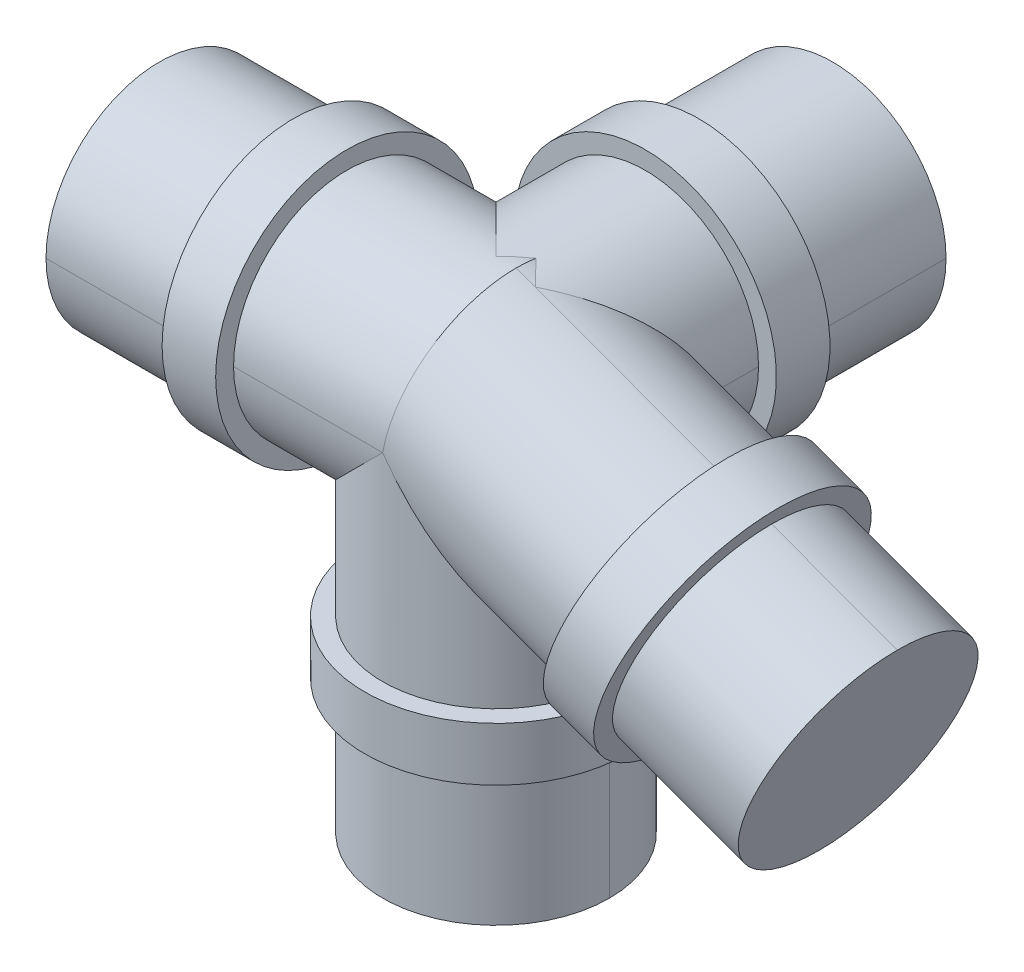
ISO-10303-21;
HEADER;
FILE_DESCRIPTION(('STEP AP214'),'2;1');
FILE_NAME('part.step','',(''),(''),'','','');
FILE_SCHEMA(('AUTOMOTIVE_DESIGN { 1 0 10303 214 1 1 1 1 }'));
ENDSEC;
DATA;
#1=APPLICATION_CONTEXT('core data for automotive mechanical design processes');
#2=APPLICATION_PROTOCOL_DEFINITION('international standard','automotive_design',2000,#1);
#3=PRODUCT_CONTEXT('',#1,'mechanical');
#4=PRODUCT('Part','Part','',(#3));
#5=PRODUCT_RELATED_PRODUCT_CATEGORY('part','',(#4));
#6=PRODUCT_DEFINITION_FORMATION('','',#4);
#7=PRODUCT_DEFINITION_CONTEXT('part definition',#1,'design');
#8=PRODUCT_DEFINITION('design','',#6,#7);
#9=PRODUCT_DEFINITION_SHAPE('','',#8);
#10=(LENGTH_UNIT() NAMED_UNIT(*) SI_UNIT(.MILLI.,.METRE.));
#11=(NAMED_UNIT(*) PLANE_ANGLE_UNIT() SI_UNIT($,.RADIAN.));
#12=(NAMED_UNIT(*) SI_UNIT($,.STERADIAN.) SOLID_ANGLE_UNIT());
#13=UNCERTAINTY_MEASURE_WITH_UNIT(LENGTH_MEASURE(1.E-05),#10,'distance_accuracy_value','');
#14=(GEOMETRIC_REPRESENTATION_CONTEXT(3) GLOBAL_UNCERTAINTY_ASSIGNED_CONTEXT((#13)) GLOBAL_UNIT_ASSIGNED_CONTEXT((#10,
#11,#12)) REPRESENTATION_CONTEXT('',''));
#15=CARTESIAN_POINT('',(0.,0.,0.));
#16=DIRECTION('',(0.,0.,1.));
#17=DIRECTION('',(1.,0.,0.));
#18=AXIS2_PLACEMENT_3D('',#15,#16,#17);
#19=CARTESIAN_POINT('',(1294.34173599784,3043.29092558478,4064.45483546757));
#20=DIRECTION('',(0.93831547214276,-0.345780385125456,0.));
#21=DIRECTION('',(0.345780385125456,0.93831547214276,0.));
#22=AXIS2_PLACEMENT_3D('',#19,#20,#21);
#23=CYLINDRICAL_SURFACE('',#22,12.7);
#24=DIRECTION('',(0.93831547214276,-0.345780385125459,0.));
#25=VECTOR('',#24,1.);
#26=CARTESIAN_POINT('',(1298.73314688893,3055.20753208099,4064.45483546757));
#27=LINE('',#26,#25);
#28=CARTESIAN_POINT('',(1303.50380398612,3053.44948833415,4064.45483546757));
#29=VERTEX_POINT('',#28);
#30=CARTESIAN_POINT('',(1324.34847676578,3045.76797908108,4064.45483546757));
#31=VERTEX_POINT('',#30);
#32=EDGE_CURVE('E178',#29,#31,#27,.T.);
#33=ORIENTED_EDGE('',*,*,#32,.T.);
#34=CARTESIAN_POINT('',(1319.95706587469,3033.85137258486,4064.45483546757));
#35=DIRECTION('',(0.938315472142761,-0.345780385125454,0.));
#36=DIRECTION('',(0.345780385125454,0.938315472142761,0.));
#37=AXIS2_PLACEMENT_3D('',#34,#35,#36);
#38=CIRCLE('',#37,12.7000000000003);
#39=CARTESIAN_POINT('',(1315.5656549836,3021.93476608865,4064.45483546757));
#40=VERTEX_POINT('',#39);
#41=EDGE_CURVE('E53',#40,#31,#38,.T.);
#42=ORIENTED_EDGE('',*,*,#41,.F.);
#43=DIRECTION('',(0.93831547214276,-0.345780385125459,0.));
#44=VECTOR('',#43,1.);
#45=CARTESIAN_POINT('',(1289.95032510674,3031.37431908857,4064.45483546757));
#46=LINE('',#45,#44);
#47=CARTESIAN_POINT('',(1311.81239309502,3023.31788762915,4064.45483546757));
#48=VERTEX_POINT('',#47);
#49=EDGE_CURVE('E381',#48,#40,#46,.T.);
#50=ORIENTED_EDGE('',*,*,#49,.F.);
#51=CARTESIAN_POINT('',(1311.81239309502,3023.31788762915,4064.45483546757));
#52=CARTESIAN_POINT('',(1311.81239309502,3023.31788762915,4060.21734666115));
#53=CARTESIAN_POINT('',(1309.85197657414,3026.12961798937,4056.46060892089));
#54=CARTESIAN_POINT('',(1306.37596940711,3031.11508652614,4054.03704015577));
#55=(BOUNDED_CURVE() B_SPLINE_CURVE(3,(#51,#52,#53,#54),.UNSPECIFIED.,.F.,
.F.) B_SPLINE_CURVE_WITH_KNOTS((4,4),(0.,0.961933335972185),
.UNSPECIFIED.) CURVE() GEOMETRIC_REPRESENTATION_ITEM() RATIONAL_B_SPLINE_CURVE((1.,
0.924365414185551,0.924365414185551,1.)) REPRESENTATION_ITEM(''));
#56=CARTESIAN_POINT('',(1306.37596940711,3031.11508652614,4054.03704015577));
#57=VERTEX_POINT('',#56);
#58=EDGE_CURVE('E179',#48,#57,#55,.T.);
#59=ORIENTED_EDGE('',*,*,#58,.T.);
#60=CARTESIAN_POINT('',(1311.81239309502,3041.53288183794,4052.53822897135));
#61=CARTESIAN_POINT('',(1311.81239309502,3037.29539303152,4051.07298845991));
#62=CARTESIAN_POINT('',(1309.85197657414,3033.53865529126,4051.61347139065));
#63=CARTESIAN_POINT('',(1306.37596940711,3031.11508652614,4054.03704015577));
#64=(BOUNDED_CURVE() B_SPLINE_CURVE(3,(#60,#61,#62,#63),.UNSPECIFIED.,.F.,
.F.) B_SPLINE_CURVE_WITH_KNOTS((4,4),(5.93011496203012,6.89204829800231),
.UNSPECIFIED.) CURVE() GEOMETRIC_REPRESENTATION_ITEM() RATIONAL_B_SPLINE_CURVE((1.,
0.924365414185551,0.924365414185551,1.)) REPRESENTATION_ITEM(''));
#65=CARTESIAN_POINT('',(1311.81239309502,3041.53288183794,4052.53822897135));
#66=VERTEX_POINT('',#65);
#67=EDGE_CURVE('E272',#66,#57,#64,.T.);
#68=ORIENTED_EDGE('',*,*,#67,.F.);
#69=CARTESIAN_POINT('',(1303.50380398612,3053.44948833415,4064.45483546757));
#70=CARTESIAN_POINT('',(1308.66591260308,3051.54719005748,4058.95337165266));
#71=CARTESIAN_POINT('',(1311.81239309502,3047.03434565284,4054.44052724803));
#72=CARTESIAN_POINT('',(1311.81239309502,3041.53288183794,4052.53822897135));
#73=(BOUNDED_CURVE() B_SPLINE_CURVE(3,(#69,#70,#71,#72),.UNSPECIFIED.,.F.,
.F.) B_SPLINE_CURVE_WITH_KNOTS((4,4),(4.71238898038468,5.93011496203012),
.UNSPECIFIED.) CURVE() GEOMETRIC_REPRESENTATION_ITEM() RATIONAL_B_SPLINE_CURVE((1.,
0.880199228965577,0.880199228965577,1.)) REPRESENTATION_ITEM(''));
#74=EDGE_CURVE('E253',#29,#66,#73,.T.);
#75=ORIENTED_EDGE('',*,*,#74,.F.);
#76=EDGE_LOOP('',(#33,#42,#50,#59,#68,#75));
#77=FACE_BOUND('',#76,.T.);
#78=ADVANCED_FACE('F39',(#77),#23,.T.);
#79=CARTESIAN_POINT('',(1294.34173599784,3043.29092558478,4064.45483546757));
#80=DIRECTION('',(0.93831547214276,-0.345780385125456,0.));
#81=DIRECTION('',(0.345780385125456,0.93831547214276,0.));
#82=AXIS2_PLACEMENT_3D('',#79,#80,#81);
#83=CYLINDRICAL_SURFACE('',#82,12.7);
#84=ORIENTED_EDGE('',*,*,#49,.T.);
#85=EDGE_CURVE('E189',#31,#40,#38,.T.);
#86=ORIENTED_EDGE('',*,*,#85,.F.);
#87=ORIENTED_EDGE('',*,*,#32,.F.);
#88=DIRECTION('',(0.93831547214276,-0.345780385125459,0.));
#89=VECTOR('',#88,1.);
#90=CARTESIAN_POINT('',(1298.73314688893,3055.20753208099,4064.45483546757));
#91=LINE('',#90,#89);
#92=CARTESIAN_POINT('',(1301.37797419067,3054.23288183794,4064.45483546757));
#93=VERTEX_POINT('',#92);
#94=EDGE_CURVE('E244',#93,#29,#91,.T.);
#95=ORIENTED_EDGE('',*,*,#94,.F.);
#96=CARTESIAN_POINT('',(1299.11239309502,3041.53288183794,4077.15483546757));
#97=CARTESIAN_POINT('',(1300.4395397742,3048.9723695958,4077.15483546757));
#98=CARTESIAN_POINT('',(1301.37797419067,3054.23288183794,4071.89432322543));
#99=CARTESIAN_POINT('',(1301.37797419067,3054.23288183794,4064.45483546757));
#100=(BOUNDED_CURVE() B_SPLINE_CURVE(3,(#96,#97,#98,#99),.UNSPECIFIED.,.F.,
.F.) B_SPLINE_CURVE_WITH_KNOTS((4,4),(4.71238898038469,6.28318530717959),
.UNSPECIFIED.) CURVE() GEOMETRIC_REPRESENTATION_ITEM() RATIONAL_B_SPLINE_CURVE((1.,
0.804737854124365,0.804737854124365,1.)) REPRESENTATION_ITEM(''));
#101=CARTESIAN_POINT('',(1299.11239309502,3041.53288183794,4077.15483546757));
#102=VERTEX_POINT('',#101);
#103=EDGE_CURVE('E364',#102,#93,#100,.T.);
#104=ORIENTED_EDGE('',*,*,#103,.F.);
#105=CARTESIAN_POINT('',(1299.11239309502,3041.53288183794,4077.15483546757));
#106=CARTESIAN_POINT('',(1306.55188085289,3030.86278526898,4077.15483546757));
#107=CARTESIAN_POINT('',(1311.81239309502,3023.31788762915,4071.89432322543));
#108=CARTESIAN_POINT('',(1311.81239309502,3023.31788762915,4064.45483546757));
#109=(BOUNDED_CURVE() B_SPLINE_CURVE(3,(#105,#106,#107,#108),.UNSPECIFIED.,.F.,
.F.) B_SPLINE_CURVE_WITH_KNOTS((4,4),(4.71238898038469,6.28318530717959),
.UNSPECIFIED.) CURVE() GEOMETRIC_REPRESENTATION_ITEM() RATIONAL_B_SPLINE_CURVE((1.,
0.804737854124365,0.804737854124365,1.)) REPRESENTATION_ITEM(''));
#110=EDGE_CURVE('E363',#102,#48,#109,.T.);
#111=ORIENTED_EDGE('',*,*,#110,.T.);
#112=EDGE_LOOP('',(#84,#86,#87,#95,#104,#111));
#113=FACE_BOUND('',#112,.T.);
#114=ADVANCED_FACE('F430',(#113),#83,.T.);
#115=CARTESIAN_POINT('',(689.977879517008,3041.53288183794,4064.45483546757));
#116=DIRECTION('',(1.,0.,0.));
#117=DIRECTION('',(0.,0.,-1.));
#118=AXIS2_PLACEMENT_3D('',#115,#116,#117);
#119=CYLINDRICAL_SURFACE('',#118,12.7);
#120=DIRECTION('',(1.,0.,0.));
#121=VECTOR('',#120,1.);
#122=CARTESIAN_POINT('',(689.977879517008,3041.53288183794,4077.15483546757));
#123=LINE('',#122,#121);
#124=CARTESIAN_POINT('',(1282.41239309502,3041.53288183794,4077.15483546757));
#125=VERTEX_POINT('',#124);
#126=EDGE_CURVE('E262',#125,#102,#123,.T.);
#127=ORIENTED_EDGE('',*,*,#126,.F.);
#128=CARTESIAN_POINT('',(1282.41239309502,3041.53288183794,4064.45483546757));
#129=DIRECTION('',(-1.,0.,0.));
#130=DIRECTION('',(0.,0.,1.));
#131=AXIS2_PLACEMENT_3D('',#128,#129,#130);
#132=CIRCLE('',#131,12.7000000000003);
#133=CARTESIAN_POINT('',(1282.41239309502,3041.53288183794,4051.75483546757));
#134=VERTEX_POINT('',#133);
#135=EDGE_CURVE('E202',#134,#125,#132,.T.);
#136=ORIENTED_EDGE('',*,*,#135,.F.);
#137=DIRECTION('',(1.,0.,0.));
#138=VECTOR('',#137,1.);
#139=CARTESIAN_POINT('',(689.977879517008,3041.53288183794,4051.75483546757));
#140=LINE('',#139,#138);
#141=CARTESIAN_POINT('',(1286.41239309502,3041.53288183794,4051.75483546757));
#142=VERTEX_POINT('',#141);
#143=EDGE_CURVE('E347',#134,#142,#140,.T.);
#144=ORIENTED_EDGE('',*,*,#143,.T.);
#145=CARTESIAN_POINT('',(1290.13213697395,3032.55262571687,4055.4745793465));
#146=CARTESIAN_POINT('',(1287.71859344203,3034.96616924879,4053.06103581458));
#147=CARTESIAN_POINT('',(1286.41239309502,3038.11961584172,4051.75483546757));
#148=CARTESIAN_POINT('',(1286.41239309502,3041.53288183794,4051.75483546757));
#149=(BOUNDED_CURVE() B_SPLINE_CURVE(3,(#145,#146,#147,#148),.UNSPECIFIED.,.F.,
.F.) B_SPLINE_CURVE_WITH_KNOTS((4,4),(2.35619449019234,3.1415926535898),
.UNSPECIFIED.) CURVE() GEOMETRIC_REPRESENTATION_ITEM() RATIONAL_B_SPLINE_CURVE((1.,
0.949253021674191,0.949253021674191,1.)) REPRESENTATION_ITEM(''));
#150=CARTESIAN_POINT('',(1290.13213697395,3032.55262571687,4055.4745793465));
#151=VERTEX_POINT('',#150);
#152=EDGE_CURVE('E245',#151,#142,#149,.T.);
#153=ORIENTED_EDGE('',*,*,#152,.F.);
#154=CARTESIAN_POINT('',(1290.13213697395,3032.55262571687,4055.4745793465));
#155=CARTESIAN_POINT('',(1287.71859344203,3030.13908218495,4057.88812287842));
#156=CARTESIAN_POINT('',(1286.41239309502,3028.83288183794,4061.04156947135));
#157=CARTESIAN_POINT('',(1286.41239309502,3028.83288183794,4064.45483546757));
#158=(BOUNDED_CURVE() B_SPLINE_CURVE(3,(#154,#155,#156,#157),.UNSPECIFIED.,.F.,
.F.) B_SPLINE_CURVE_WITH_KNOTS((4,4),(2.35619449019234,3.1415926535898),
.UNSPECIFIED.) CURVE() GEOMETRIC_REPRESENTATION_ITEM() RATIONAL_B_SPLINE_CURVE((1.,
0.949253021674191,0.949253021674191,1.)) REPRESENTATION_ITEM(''));
#159=CARTESIAN_POINT('',(1286.41239309502,3028.83288183794,4064.45483546757));
#160=VERTEX_POINT('',#159);
#161=EDGE_CURVE('E325',#151,#160,#158,.T.);
#162=ORIENTED_EDGE('',*,*,#161,.T.);
#163=CARTESIAN_POINT('',(1286.41239309502,3028.83288183794,4064.45483546757));
#164=CARTESIAN_POINT('',(1286.41239309502,3028.83288183794,4071.89432322543));
#165=CARTESIAN_POINT('',(1291.67290533716,3034.09339408007,4077.15483546757));
#166=CARTESIAN_POINT('',(1299.11239309502,3041.53288183794,4077.15483546757));
#167=(BOUNDED_CURVE() B_SPLINE_CURVE(3,(#163,#164,#165,#166),.UNSPECIFIED.,.F.,
.F.) B_SPLINE_CURVE_WITH_KNOTS((4,4),(3.1415926535898,4.71238898038469),
.UNSPECIFIED.) CURVE() GEOMETRIC_REPRESENTATION_ITEM() RATIONAL_B_SPLINE_CURVE((1.,
0.804737854124365,0.804737854124365,1.)) REPRESENTATION_ITEM(''));
#168=EDGE_CURVE('E316',#160,#102,#167,.T.);
#169=ORIENTED_EDGE('',*,*,#168,.T.);
#170=EDGE_LOOP('',(#127,#136,#144,#153,#162,#169));
#171=FACE_BOUND('',#170,.T.);
#172=ADVANCED_FACE('F438',(#171),#119,.T.);
#173=CARTESIAN_POINT('',(689.977879517008,3041.53288183794,4064.45483546757));
#174=DIRECTION('',(1.,0.,0.));
#175=DIRECTION('',(0.,0.,-1.));
#176=AXIS2_PLACEMENT_3D('',#173,#174,#175);
#177=CYLINDRICAL_SURFACE('',#176,12.7);
#178=ORIENTED_EDGE('',*,*,#143,.F.);
#179=EDGE_CURVE('E199',#125,#134,#132,.T.);
#180=ORIENTED_EDGE('',*,*,#179,.F.);
#181=ORIENTED_EDGE('',*,*,#126,.T.);
#182=ORIENTED_EDGE('',*,*,#103,.T.);
#183=CARTESIAN_POINT('',(1301.37797419067,3054.23288183794,4064.45483546757));
#184=CARTESIAN_POINT('',(1301.37797419067,3054.23288183794,4063.70653116427));
#185=CARTESIAN_POINT('',(1301.36620649862,3054.16691655895,4062.96114005063));
#186=CARTESIAN_POINT('',(1301.34276273906,3054.03549961386,4062.22446582353));
#187=(BOUNDED_CURVE() B_SPLINE_CURVE(3,(#183,#184,#185,#186),.UNSPECIFIED.,.F.,
.F.) B_SPLINE_CURVE_WITH_KNOTS((4,4),(0.,0.176535172574716),
.UNSPECIFIED.) CURVE() GEOMETRIC_REPRESENTATION_ITEM() RATIONAL_B_SPLINE_CURVE((1.,
0.997404630140262,0.997404630140262,1.)) REPRESENTATION_ITEM(''));
#188=CARTESIAN_POINT('',(1301.34276273906,3054.03549961386,4062.22446582353));
#189=VERTEX_POINT('',#188);
#190=EDGE_CURVE('E354',#93,#189,#187,.T.);
#191=ORIENTED_EDGE('',*,*,#190,.T.);
#192=CARTESIAN_POINT('',(1299.11239309502,3054.23288183794,4064.45483546757));
#193=CARTESIAN_POINT('',(1299.86069739832,3054.23288183794,4063.70653116427));
#194=CARTESIAN_POINT('',(1300.60608851196,3054.16691655895,4062.96114005063));
#195=CARTESIAN_POINT('',(1301.34276273906,3054.03549961386,4062.22446582353));
#196=(BOUNDED_CURVE() B_SPLINE_CURVE(3,(#192,#193,#194,#195),.UNSPECIFIED.,.F.,
.F.) B_SPLINE_CURVE_WITH_KNOTS((4,4),(4.71238898038469,4.88892415295942),
.UNSPECIFIED.) CURVE() GEOMETRIC_REPRESENTATION_ITEM() RATIONAL_B_SPLINE_CURVE((1.,
0.997404630140262,0.997404630140262,1.)) REPRESENTATION_ITEM(''));
#197=CARTESIAN_POINT('',(1299.11239309502,3054.23288183794,4064.45483546757));
#198=VERTEX_POINT('',#197);
#199=EDGE_CURVE('E298',#198,#189,#196,.T.);
#200=ORIENTED_EDGE('',*,*,#199,.F.);
#201=CARTESIAN_POINT('',(1286.41239309502,3041.53288183794,4051.75483546757));
#202=CARTESIAN_POINT('',(1286.41239309502,3048.9723695958,4051.75483546757));
#203=CARTESIAN_POINT('',(1291.67290533716,3054.23288183794,4057.01534770971));
#204=CARTESIAN_POINT('',(1299.11239309502,3054.23288183794,4064.45483546757));
#205=(BOUNDED_CURVE() B_SPLINE_CURVE(3,(#201,#202,#203,#204),.UNSPECIFIED.,.F.,
.F.) B_SPLINE_CURVE_WITH_KNOTS((4,4),(3.1415926535898,4.71238898038469),
.UNSPECIFIED.) CURVE() GEOMETRIC_REPRESENTATION_ITEM() RATIONAL_B_SPLINE_CURVE((1.,
0.804737854124364,0.804737854124364,1.)) REPRESENTATION_ITEM(''));
#206=EDGE_CURVE('E292',#142,#198,#205,.T.);
#207=ORIENTED_EDGE('',*,*,#206,.F.);
#208=EDGE_LOOP('',(#178,#180,#181,#182,#191,#200,#207));
#209=FACE_BOUND('',#208,.T.);
#210=ADVANCED_FACE('F492',(#209),#177,.T.);
#211=CARTESIAN_POINT('',(1299.11239309502,3041.53288183794,3664.45483546757));
#212=DIRECTION('',(0.,0.,1.));
#213=DIRECTION('',(1.,0.,0.));
#214=AXIS2_PLACEMENT_3D('',#211,#212,#213);
#215=CYLINDRICAL_SURFACE('',#214,12.7);
#216=DIRECTION('',(0.,0.,1.));
#217=VECTOR('',#216,1.);
#218=CARTESIAN_POINT('',(1286.41239309502,3041.53288183794,3664.45483546757));
#219=LINE('',#218,#217);
#220=CARTESIAN_POINT('',(1286.41239309502,3041.53288183794,4047.75483546757));
#221=VERTEX_POINT('',#220);
#222=EDGE_CURVE('E251',#221,#142,#219,.T.);
#223=ORIENTED_EDGE('',*,*,#222,.F.);
#224=CARTESIAN_POINT('',(1299.11239309502,3041.53288183794,4047.75483546757));
#225=DIRECTION('',(0.,0.,-1.));
#226=DIRECTION('',(-1.,0.,0.));
#227=AXIS2_PLACEMENT_3D('',#224,#225,#226);
#228=CIRCLE('',#227,12.7000000000001);
#229=CARTESIAN_POINT('',(1311.81239309502,3041.53288183794,4047.75483546757));
#230=VERTEX_POINT('',#229);
#231=EDGE_CURVE('E214',#230,#221,#228,.T.);
#232=ORIENTED_EDGE('',*,*,#231,.F.);
#233=DIRECTION('',(0.,0.,1.));
#234=VECTOR('',#233,1.);
#235=CARTESIAN_POINT('',(1311.81239309502,3041.53288183794,3664.45483546757));
#236=LINE('',#235,#234);
#237=EDGE_CURVE('E279',#230,#66,#236,.T.);
#238=ORIENTED_EDGE('',*,*,#237,.T.);
#239=ORIENTED_EDGE('',*,*,#67,.T.);
#240=CARTESIAN_POINT('',(1306.37596940711,3031.11508652614,4054.03704015577));
#241=CARTESIAN_POINT('',(1301.09571159611,3027.43354408747,4050.3554977171));
#242=CARTESIAN_POINT('',(1294.68377828662,3028.0009844042,4050.92293803383));
#243=CARTESIAN_POINT('',(1290.13213697395,3032.55262571687,4055.4745793465));
#244=(BOUNDED_CURVE() B_SPLINE_CURVE(3,(#240,#241,#242,#243),.UNSPECIFIED.,.F.,
.F.) B_SPLINE_CURVE_WITH_KNOTS((4,4),(2.53272966276708,3.92699081698724),
.UNSPECIFIED.) CURVE() GEOMETRIC_REPRESENTATION_ITEM() RATIONAL_B_SPLINE_CURVE((1.,
0.844458379353469,0.844458379353469,1.)) REPRESENTATION_ITEM(''));
#245=EDGE_CURVE('E252',#57,#151,#244,.T.);
#246=ORIENTED_EDGE('',*,*,#245,.T.);
#247=ORIENTED_EDGE('',*,*,#152,.T.);
#248=EDGE_LOOP('',(#223,#232,#238,#239,#246,#247));
#249=FACE_BOUND('',#248,.T.);
#250=ADVANCED_FACE('F471',(#249),#215,.T.);
#251=CARTESIAN_POINT('',(1299.11239309502,3041.53288183794,3664.45483546757));
#252=DIRECTION('',(0.,0.,1.));
#253=DIRECTION('',(1.,0.,0.));
#254=AXIS2_PLACEMENT_3D('',#251,#252,#253);
#255=CYLINDRICAL_SURFACE('',#254,12.7);
#256=ORIENTED_EDGE('',*,*,#237,.F.);
#257=EDGE_CURVE('E211',#221,#230,#228,.T.);
#258=ORIENTED_EDGE('',*,*,#257,.F.);
#259=ORIENTED_EDGE('',*,*,#222,.T.);
#260=ORIENTED_EDGE('',*,*,#206,.T.);
#261=ORIENTED_EDGE('',*,*,#199,.T.);
#262=CARTESIAN_POINT('',(1301.34276273906,3054.03549961386,4062.22446582353));
#263=CARTESIAN_POINT('',(1302.07943696616,3053.90408266878,4062.96114005063));
#264=CARTESIAN_POINT('',(1302.80165848047,3053.70823728433,4063.70653116427));
#265=CARTESIAN_POINT('',(1303.50380398612,3053.44948833415,4064.45483546757));
#266=(BOUNDED_CURVE() B_SPLINE_CURVE(3,(#262,#263,#264,#265),.UNSPECIFIED.,.F.,
.F.) B_SPLINE_CURVE_WITH_KNOTS((4,4),(4.53585380780997,4.71238898038469),
.UNSPECIFIED.) CURVE() GEOMETRIC_REPRESENTATION_ITEM() RATIONAL_B_SPLINE_CURVE((1.,
0.997404630140262,0.997404630140262,1.)) REPRESENTATION_ITEM(''));
#267=EDGE_CURVE('E263',#189,#29,#266,.T.);
#268=ORIENTED_EDGE('',*,*,#267,.T.);
#269=ORIENTED_EDGE('',*,*,#74,.T.);
#270=EDGE_LOOP('',(#256,#258,#259,#260,#261,#268,#269));
#271=FACE_BOUND('',#270,.T.);
#272=ADVANCED_FACE('F466',(#271),#255,.T.);
#273=CARTESIAN_POINT('',(1299.11239309502,3041.53288183794,4064.45483546757));
#274=DIRECTION('',(0.,-1.,0.));
#275=DIRECTION('',(1.,0.,0.));
#276=AXIS2_PLACEMENT_3D('',#273,#274,#275);
#277=CYLINDRICAL_SURFACE('',#276,12.7);
#278=DIRECTION('',(0.,-1.,0.));
#279=VECTOR('',#278,1.);
#280=CARTESIAN_POINT('',(1286.41239309502,3041.53288183794,4064.45483546757));
#281=LINE('',#280,#279);
#282=CARTESIAN_POINT('',(1286.41239309502,3019.31788762915,4064.45483546757));
#283=VERTEX_POINT('',#282);
#284=EDGE_CURVE('E334',#160,#283,#281,.T.);
#285=ORIENTED_EDGE('',*,*,#284,.T.);
#286=CARTESIAN_POINT('',(1299.11239309502,3019.31788762915,4064.45483546757));
#287=DIRECTION('',(0.,-1.,0.));
#288=DIRECTION('',(0.,0.,-1.));
#289=AXIS2_PLACEMENT_3D('',#286,#287,#288);
#290=CIRCLE('',#289,12.7000000000002);
#291=CARTESIAN_POINT('',(1311.81239309502,3019.31788762915,4064.45483546757));
#292=VERTEX_POINT('',#291);
#293=EDGE_CURVE('E223',#292,#283,#290,.T.);
#294=ORIENTED_EDGE('',*,*,#293,.F.);
#295=DIRECTION('',(0.,-1.,0.));
#296=VECTOR('',#295,1.);
#297=CARTESIAN_POINT('',(1311.81239309502,3041.53288183794,4064.45483546757));
#298=LINE('',#297,#296);
#299=EDGE_CURVE('E343',#48,#292,#298,.T.);
#300=ORIENTED_EDGE('',*,*,#299,.F.);
#301=ORIENTED_EDGE('',*,*,#110,.F.);
#302=ORIENTED_EDGE('',*,*,#168,.F.);
#303=EDGE_LOOP('',(#285,#294,#300,#301,#302));
#304=FACE_BOUND('',#303,.T.);
#305=ADVANCED_FACE('F474',(#304),#277,.T.);
#306=CARTESIAN_POINT('',(1299.11239309502,3041.53288183794,4064.45483546757));
#307=DIRECTION('',(0.,-1.,0.));
#308=DIRECTION('',(1.,0.,0.));
#309=AXIS2_PLACEMENT_3D('',#306,#307,#308);
#310=CYLINDRICAL_SURFACE('',#309,12.7);
#311=ORIENTED_EDGE('',*,*,#299,.T.);
#312=CARTESIAN_POINT('',(1299.11239309502,3019.31788762915,4064.45483546757));
#313=DIRECTION('',(0.,-1.,0.));
#314=DIRECTION('',(0.,0.,-1.));
#315=AXIS2_PLACEMENT_3D('',#312,#313,#314);
#316=CIRCLE('',#315,12.7);
#317=EDGE_CURVE('E11',#292,#283,#316,.F.);
#318=ORIENTED_EDGE('',*,*,#317,.T.);
#319=ORIENTED_EDGE('',*,*,#284,.F.);
#320=ORIENTED_EDGE('',*,*,#161,.F.);
#321=ORIENTED_EDGE('',*,*,#245,.F.);
#322=ORIENTED_EDGE('',*,*,#58,.F.);
#323=EDGE_LOOP('',(#311,#318,#319,#320,#321,#322));
#324=FACE_BOUND('',#323,.T.);
#325=ADVANCED_FACE('F423',(#324),#310,.T.);
#326=CARTESIAN_POINT('',(1294.34173599784,3043.29092558478,4064.45483546757));
#327=DIRECTION('',(0.93831547214276,-0.345780385125456,0.));
#328=DIRECTION('',(0.345780385125456,0.93831547214276,0.));
#329=AXIS2_PLACEMENT_3D('',#326,#327,#328);
#330=CYLINDRICAL_SURFACE('',#329,12.7);
#331=ORIENTED_EDGE('',*,*,#190,.F.);
#332=ORIENTED_EDGE('',*,*,#94,.T.);
#333=ORIENTED_EDGE('',*,*,#267,.F.);
#334=EDGE_LOOP('',(#331,#332,#333));
#335=FACE_BOUND('',#334,.T.);
#336=ADVANCED_FACE('F475',(#335),#330,.T.);
#337=CARTESIAN_POINT('',(1299.11239309502,3019.31788762915,4064.45483546757));
#338=DIRECTION('',(0.,-1.,0.));
#339=DIRECTION('',(0.,0.,-1.));
#340=AXIS2_PLACEMENT_3D('',#337,#338,#339);
#341=CYLINDRICAL_SURFACE('',#340,14.7000000000002);
#342=CARTESIAN_POINT('',(1299.11239309502,3019.31788762915,4064.45483546757));
#343=DIRECTION('',(0.,-1.,0.));
#344=DIRECTION('',(0.,0.,-1.));
#345=AXIS2_PLACEMENT_3D('',#342,#343,#344);
#346=CIRCLE('',#345,14.7000000000002);
#347=CARTESIAN_POINT('',(1299.11239309502,3019.31788762915,4049.75483546757));
#348=VERTEX_POINT('',#347);
#349=EDGE_CURVE('E228',#348,#348,#346,.T.);
#350=ORIENTED_EDGE('',*,*,#349,.T.);
#351=EDGE_LOOP('',(#350));
#352=FACE_BOUND('',#351,.T.);
#353=CARTESIAN_POINT('',(1299.11239309502,3013.31788762915,4064.45483546757));
#354=DIRECTION('',(0.,-1.,0.));
#355=DIRECTION('',(0.,0.,-1.));
#356=AXIS2_PLACEMENT_3D('',#353,#354,#355);
#357=CIRCLE('',#356,14.7000000000002);
#358=CARTESIAN_POINT('',(1299.11239309502,3013.31788762915,4049.75483546757));
#359=VERTEX_POINT('',#358);
#360=EDGE_CURVE('E225',#359,#359,#357,.T.);
#361=ORIENTED_EDGE('',*,*,#360,.F.);
#362=EDGE_LOOP('',(#361));
#363=FACE_BOUND('',#362,.T.);
#364=ADVANCED_FACE('F477',(#352,#363),#341,.T.);
#365=CARTESIAN_POINT('',(1299.11239309502,3019.31788762915,4064.45483546757));
#366=DIRECTION('',(0.,-1.,0.));
#367=DIRECTION('',(0.,0.,-1.));
#368=AXIS2_PLACEMENT_3D('',#365,#366,#367);
#369=PLANE('',#368);
#370=ORIENTED_EDGE('',*,*,#293,.T.);
#371=ORIENTED_EDGE('',*,*,#317,.F.);
#372=EDGE_LOOP('',(#370,#371));
#373=FACE_BOUND('',#372,.T.);
#374=ORIENTED_EDGE('',*,*,#349,.F.);
#375=EDGE_LOOP('',(#374));
#376=FACE_BOUND('',#375,.T.);
#377=ADVANCED_FACE('F425',(#373,#376),#369,.F.);
#378=CARTESIAN_POINT('',(1299.11239309502,3013.31788762915,4064.45483546757));
#379=DIRECTION('',(0.,-1.,0.));
#380=DIRECTION('',(0.,0.,-1.));
#381=AXIS2_PLACEMENT_3D('',#378,#379,#380);
#382=PLANE('',#381);
#383=CARTESIAN_POINT('',(1299.11239309502,3013.31788762915,4064.45483546757));
#384=DIRECTION('',(0.,-1.,0.));
#385=DIRECTION('',(0.,0.,-1.));
#386=AXIS2_PLACEMENT_3D('',#383,#384,#385);
#387=CIRCLE('',#386,12.7000000000002);
#388=CARTESIAN_POINT('',(1311.81239309502,3013.31788762915,4064.45483546757));
#389=VERTEX_POINT('',#388);
#390=CARTESIAN_POINT('',(1286.41239309502,3013.31788762915,4064.45483546757));
#391=VERTEX_POINT('',#390);
#392=EDGE_CURVE('E220',#389,#391,#387,.T.);
#393=ORIENTED_EDGE('',*,*,#392,.F.);
#394=CARTESIAN_POINT('',(1299.11239309502,3013.31788762915,4064.45483546757));
#395=DIRECTION('',(0.,-1.,0.));
#396=DIRECTION('',(0.,0.,-1.));
#397=AXIS2_PLACEMENT_3D('',#394,#395,#396);
#398=CIRCLE('',#397,12.7);
#399=EDGE_CURVE('E47',#389,#391,#398,.F.);
#400=ORIENTED_EDGE('',*,*,#399,.T.);
#401=EDGE_LOOP('',(#393,#400));
#402=FACE_BOUND('',#401,.T.);
#403=ORIENTED_EDGE('',*,*,#360,.T.);
#404=EDGE_LOOP('',(#403));
#405=FACE_BOUND('',#404,.T.);
#406=ADVANCED_FACE('F404',(#402,#405),#382,.T.);
#407=CARTESIAN_POINT('',(1261.41239309502,2998.31788762915,3964.45483546757));
#408=DIRECTION('',(0.,-1.,0.));
#409=DIRECTION('',(0.,0.,-1.));
#410=AXIS2_PLACEMENT_3D('',#407,#408,#409);
#411=PLANE('',#410);
#412=CARTESIAN_POINT('',(1299.11239309502,2998.31788762915,4064.45483546757));
#413=DIRECTION('',(0.,-1.,0.));
#414=DIRECTION('',(0.,0.,-1.));
#415=AXIS2_PLACEMENT_3D('',#412,#413,#414);
#416=CIRCLE('',#415,12.7);
#417=CARTESIAN_POINT('',(1311.81239309502,2998.31788762915,4064.45483546757));
#418=VERTEX_POINT('',#417);
#419=CARTESIAN_POINT('',(1286.41239309502,2998.31788762915,4064.45483546757));
#420=VERTEX_POINT('',#419);
#421=EDGE_CURVE('E397',#418,#420,#416,.F.);
#422=ORIENTED_EDGE('',*,*,#421,.F.);
#423=CARTESIAN_POINT('',(1299.11239309502,2998.31788762915,4064.45483546757));
#424=DIRECTION('',(0.,-1.,0.));
#425=DIRECTION('',(0.,0.,-1.));
#426=AXIS2_PLACEMENT_3D('',#423,#424,#425);
#427=CIRCLE('',#426,12.7);
#428=EDGE_CURVE('E241',#420,#418,#427,.F.);
#429=ORIENTED_EDGE('',*,*,#428,.F.);
#430=EDGE_LOOP('',(#422,#429));
#431=FACE_BOUND('',#430,.T.);
#432=ADVANCED_FACE('F414',(#431),#411,.T.);
#433=ORIENTED_EDGE('',*,*,#399,.F.);
#434=EDGE_CURVE('E341',#389,#418,#298,.T.);
#435=ORIENTED_EDGE('',*,*,#434,.T.);
#436=ORIENTED_EDGE('',*,*,#421,.T.);
#437=EDGE_CURVE('E291',#391,#420,#281,.T.);
#438=ORIENTED_EDGE('',*,*,#437,.F.);
#439=EDGE_LOOP('',(#433,#435,#436,#438));
#440=FACE_BOUND('',#439,.T.);
#441=ADVANCED_FACE('F408',(#440),#310,.T.);
#442=ORIENTED_EDGE('',*,*,#392,.T.);
#443=ORIENTED_EDGE('',*,*,#437,.T.);
#444=ORIENTED_EDGE('',*,*,#428,.T.);
#445=ORIENTED_EDGE('',*,*,#434,.F.);
#446=EDGE_LOOP('',(#442,#443,#444,#445));
#447=FACE_BOUND('',#446,.T.);
#448=ADVANCED_FACE('F411',(#447),#277,.T.);
#449=CARTESIAN_POINT('',(1299.11239309502,3041.53288183794,4047.75483546757));
#450=DIRECTION('',(0.,0.,-1.));
#451=DIRECTION('',(-1.,0.,0.));
#452=AXIS2_PLACEMENT_3D('',#449,#450,#451);
#453=CYLINDRICAL_SURFACE('',#452,14.7000000000002);
#454=CARTESIAN_POINT('',(1299.11239309502,3041.53288183794,4047.75483546757));
#455=DIRECTION('',(0.,0.,-1.));
#456=DIRECTION('',(-1.,0.,0.));
#457=AXIS2_PLACEMENT_3D('',#454,#455,#456);
#458=CIRCLE('',#457,14.7000000000002);
#459=CARTESIAN_POINT('',(1284.41239309502,3041.53288183794,4047.75483546757));
#460=VERTEX_POINT('',#459);
#461=EDGE_CURVE('E217',#460,#460,#458,.T.);
#462=ORIENTED_EDGE('',*,*,#461,.T.);
#463=EDGE_LOOP('',(#462));
#464=FACE_BOUND('',#463,.T.);
#465=CARTESIAN_POINT('',(1299.11239309502,3041.53288183794,4041.75483546757));
#466=DIRECTION('',(0.,0.,-1.));
#467=DIRECTION('',(-1.,0.,0.));
#468=AXIS2_PLACEMENT_3D('',#465,#466,#467);
#469=CIRCLE('',#468,14.7000000000002);
#470=CARTESIAN_POINT('',(1284.41239309502,3041.53288183794,4041.75483546757));
#471=VERTEX_POINT('',#470);
#472=EDGE_CURVE('E213',#471,#471,#469,.T.);
#473=ORIENTED_EDGE('',*,*,#472,.F.);
#474=EDGE_LOOP('',(#473));
#475=FACE_BOUND('',#474,.T.);
#476=ADVANCED_FACE('F473',(#464,#475),#453,.T.);
#477=CARTESIAN_POINT('',(1299.11239309502,3041.53288183794,4047.75483546757));
#478=DIRECTION('',(0.,0.,-1.));
#479=DIRECTION('',(-1.,0.,0.));
#480=AXIS2_PLACEMENT_3D('',#477,#478,#479);
#481=PLANE('',#480);
#482=ORIENTED_EDGE('',*,*,#257,.T.);
#483=ORIENTED_EDGE('',*,*,#231,.T.);
#484=EDGE_LOOP('',(#482,#483));
#485=FACE_BOUND('',#484,.T.);
#486=ORIENTED_EDGE('',*,*,#461,.F.);
#487=EDGE_LOOP('',(#486));
#488=FACE_BOUND('',#487,.T.);
#489=ADVANCED_FACE('F518',(#485,#488),#481,.F.);
#490=CARTESIAN_POINT('',(1299.11239309502,3041.53288183794,4041.75483546757));
#491=DIRECTION('',(0.,0.,-1.));
#492=DIRECTION('',(-1.,0.,0.));
#493=AXIS2_PLACEMENT_3D('',#490,#491,#492);
#494=PLANE('',#493);
#495=CARTESIAN_POINT('',(1299.11239309502,3041.53288183794,4041.75483546757));
#496=DIRECTION('',(0.,0.,-1.));
#497=DIRECTION('',(-1.,0.,0.));
#498=AXIS2_PLACEMENT_3D('',#495,#496,#497);
#499=CIRCLE('',#498,12.7000000000001);
#500=CARTESIAN_POINT('',(1286.41239309502,3041.53288183794,4041.75483546757));
#501=VERTEX_POINT('',#500);
#502=CARTESIAN_POINT('',(1311.81239309502,3041.53288183794,4041.75483546757));
#503=VERTEX_POINT('',#502);
#504=EDGE_CURVE('E215',#501,#503,#499,.T.);
#505=ORIENTED_EDGE('',*,*,#504,.F.);
#506=EDGE_CURVE('E208',#503,#501,#499,.T.);
#507=ORIENTED_EDGE('',*,*,#506,.F.);
#508=EDGE_LOOP('',(#505,#507));
#509=FACE_BOUND('',#508,.T.);
#510=ORIENTED_EDGE('',*,*,#472,.T.);
#511=EDGE_LOOP('',(#510));
#512=FACE_BOUND('',#511,.T.);
#513=ADVANCED_FACE('F521',(#509,#512),#494,.T.);
#514=CARTESIAN_POINT('',(1274.11265622235,2998.31788762915,4026.75483546757));
#515=DIRECTION('',(0.,0.,-1.));
#516=DIRECTION('',(-1.,0.,0.));
#517=AXIS2_PLACEMENT_3D('',#514,#515,#516);
#518=PLANE('',#517);
#519=CARTESIAN_POINT('',(1299.11239309502,3041.53288183794,4026.75483546757));
#520=DIRECTION('',(0.,0.,-1.));
#521=DIRECTION('',(-1.,0.,0.));
#522=AXIS2_PLACEMENT_3D('',#519,#520,#521);
#523=CIRCLE('',#522,12.7);
#524=CARTESIAN_POINT('',(1286.41239309502,3041.53288183794,4026.75483546757));
#525=VERTEX_POINT('',#524);
#526=CARTESIAN_POINT('',(1311.81239309502,3041.53288183794,4026.75483546757));
#527=VERTEX_POINT('',#526);
#528=EDGE_CURVE('E231',#525,#527,#523,.F.);
#529=ORIENTED_EDGE('',*,*,#528,.F.);
#530=CARTESIAN_POINT('',(1299.11239309502,3041.53288183794,4026.75483546757));
#531=DIRECTION('',(0.,0.,-1.));
#532=DIRECTION('',(-1.,0.,0.));
#533=AXIS2_PLACEMENT_3D('',#530,#531,#532);
#534=CIRCLE('',#533,12.7);
#535=EDGE_CURVE('E400',#527,#525,#534,.F.);
#536=ORIENTED_EDGE('',*,*,#535,.F.);
#537=EDGE_LOOP('',(#529,#536));
#538=FACE_BOUND('',#537,.T.);
#539=ADVANCED_FACE('F464',(#538),#518,.T.);
#540=ORIENTED_EDGE('',*,*,#504,.T.);
#541=EDGE_CURVE('E273',#527,#503,#236,.T.);
#542=ORIENTED_EDGE('',*,*,#541,.F.);
#543=ORIENTED_EDGE('',*,*,#535,.T.);
#544=EDGE_CURVE('E299',#525,#501,#219,.T.);
#545=ORIENTED_EDGE('',*,*,#544,.T.);
#546=EDGE_LOOP('',(#540,#542,#543,#545));
#547=FACE_BOUND('',#546,.T.);
#548=ADVANCED_FACE('F460',(#547),#255,.T.);
#549=ORIENTED_EDGE('',*,*,#506,.T.);
#550=ORIENTED_EDGE('',*,*,#544,.F.);
#551=ORIENTED_EDGE('',*,*,#528,.T.);
#552=ORIENTED_EDGE('',*,*,#541,.T.);
#553=EDGE_LOOP('',(#549,#550,#551,#552));
#554=FACE_BOUND('',#553,.T.);
#555=ADVANCED_FACE('F463',(#554),#215,.T.);
#556=CARTESIAN_POINT('',(1282.41239309502,3041.53288183794,4064.45483546757));
#557=DIRECTION('',(-1.,0.,0.));
#558=DIRECTION('',(0.,0.,1.));
#559=AXIS2_PLACEMENT_3D('',#556,#557,#558);
#560=CYLINDRICAL_SURFACE('',#559,14.7000000000004);
#561=CARTESIAN_POINT('',(1282.41239309502,3041.53288183794,4064.45483546757));
#562=DIRECTION('',(-1.,0.,0.));
#563=DIRECTION('',(0.,0.,1.));
#564=AXIS2_PLACEMENT_3D('',#561,#562,#563);
#565=CIRCLE('',#564,14.7000000000004);
#566=CARTESIAN_POINT('',(1282.41239309502,3041.53288183794,4079.15483546757));
#567=VERTEX_POINT('',#566);
#568=EDGE_CURVE('E205',#567,#567,#565,.T.);
#569=ORIENTED_EDGE('',*,*,#568,.T.);
#570=EDGE_LOOP('',(#569));
#571=FACE_BOUND('',#570,.T.);
#572=CARTESIAN_POINT('',(1276.41239309502,3041.53288183794,4064.45483546757));
#573=DIRECTION('',(-1.,0.,0.));
#574=DIRECTION('',(0.,0.,1.));
#575=AXIS2_PLACEMENT_3D('',#572,#573,#574);
#576=CIRCLE('',#575,14.7000000000004);
#577=CARTESIAN_POINT('',(1276.41239309502,3041.53288183794,4079.15483546757));
#578=VERTEX_POINT('',#577);
#579=EDGE_CURVE('E201',#578,#578,#576,.T.);
#580=ORIENTED_EDGE('',*,*,#579,.F.);
#581=EDGE_LOOP('',(#580));
#582=FACE_BOUND('',#581,.T.);
#583=ADVANCED_FACE('F469',(#571,#582),#560,.T.);
#584=CARTESIAN_POINT('',(1282.41239309502,3041.53288183794,4064.45483546757));
#585=DIRECTION('',(-1.,0.,0.));
#586=DIRECTION('',(0.,0.,1.));
#587=AXIS2_PLACEMENT_3D('',#584,#585,#586);
#588=PLANE('',#587);
#589=ORIENTED_EDGE('',*,*,#179,.T.);
#590=ORIENTED_EDGE('',*,*,#135,.T.);
#591=EDGE_LOOP('',(#589,#590));
#592=FACE_BOUND('',#591,.T.);
#593=ORIENTED_EDGE('',*,*,#568,.F.);
#594=EDGE_LOOP('',(#593));
#595=FACE_BOUND('',#594,.T.);
#596=ADVANCED_FACE('F508',(#592,#595),#588,.F.);
#597=CARTESIAN_POINT('',(1276.41239309502,3041.53288183794,4064.45483546757));
#598=DIRECTION('',(-1.,0.,0.));
#599=DIRECTION('',(0.,0.,1.));
#600=AXIS2_PLACEMENT_3D('',#597,#598,#599);
#601=PLANE('',#600);
#602=CARTESIAN_POINT('',(1276.41239309502,3041.53288183794,4064.45483546757));
#603=DIRECTION('',(-1.,0.,0.));
#604=DIRECTION('',(0.,0.,1.));
#605=AXIS2_PLACEMENT_3D('',#602,#603,#604);
#606=CIRCLE('',#605,12.7000000000003);
#607=CARTESIAN_POINT('',(1276.41239309502,3041.53288183794,4077.15483546757));
#608=VERTEX_POINT('',#607);
#609=CARTESIAN_POINT('',(1276.41239309502,3041.53288183794,4051.75483546757));
#610=VERTEX_POINT('',#609);
#611=EDGE_CURVE('E203',#608,#610,#606,.T.);
#612=ORIENTED_EDGE('',*,*,#611,.F.);
#613=EDGE_CURVE('E195',#610,#608,#606,.T.);
#614=ORIENTED_EDGE('',*,*,#613,.F.);
#615=EDGE_LOOP('',(#612,#614));
#616=FACE_BOUND('',#615,.T.);
#617=ORIENTED_EDGE('',*,*,#579,.T.);
#618=EDGE_LOOP('',(#617));
#619=FACE_BOUND('',#618,.T.);
#620=ADVANCED_FACE('F544',(#616,#619),#601,.T.);
#621=CARTESIAN_POINT('',(1261.41239309502,3087.67335355749,3964.45483546757));
#622=DIRECTION('',(-1.,0.,0.));
#623=DIRECTION('',(0.,0.,1.));
#624=AXIS2_PLACEMENT_3D('',#621,#622,#623);
#625=PLANE('',#624);
#626=CARTESIAN_POINT('',(1261.41239309502,3041.53288183794,4064.45483546757));
#627=DIRECTION('',(-1.,0.,0.));
#628=DIRECTION('',(0.,0.,1.));
#629=AXIS2_PLACEMENT_3D('',#626,#627,#628);
#630=CIRCLE('',#629,12.7);
#631=CARTESIAN_POINT('',(1261.41239309502,3041.53288183794,4051.75483546757));
#632=VERTEX_POINT('',#631);
#633=CARTESIAN_POINT('',(1261.41239309502,3041.53288183794,4077.15483546757));
#634=VERTEX_POINT('',#633);
#635=EDGE_CURVE('E394',#632,#634,#630,.F.);
#636=ORIENTED_EDGE('',*,*,#635,.F.);
#637=CARTESIAN_POINT('',(1261.41239309502,3041.53288183794,4064.45483546757));
#638=DIRECTION('',(-1.,0.,0.));
#639=DIRECTION('',(0.,0.,1.));
#640=AXIS2_PLACEMENT_3D('',#637,#638,#639);
#641=CIRCLE('',#640,12.7);
#642=EDGE_CURVE('E238',#634,#632,#641,.F.);
#643=ORIENTED_EDGE('',*,*,#642,.F.);
#644=EDGE_LOOP('',(#636,#643));
#645=FACE_BOUND('',#644,.T.);
#646=ADVANCED_FACE('F543',(#645),#625,.T.);
#647=ORIENTED_EDGE('',*,*,#611,.T.);
#648=EDGE_CURVE('E353',#632,#610,#140,.T.);
#649=ORIENTED_EDGE('',*,*,#648,.F.);
#650=ORIENTED_EDGE('',*,*,#635,.T.);
#651=EDGE_CURVE('E372',#634,#608,#123,.T.);
#652=ORIENTED_EDGE('',*,*,#651,.T.);
#653=EDGE_LOOP('',(#647,#649,#650,#652));
#654=FACE_BOUND('',#653,.T.);
#655=ADVANCED_FACE('F41',(#654),#177,.T.);
#656=ORIENTED_EDGE('',*,*,#613,.T.);
#657=ORIENTED_EDGE('',*,*,#651,.F.);
#658=ORIENTED_EDGE('',*,*,#642,.T.);
#659=ORIENTED_EDGE('',*,*,#648,.T.);
#660=EDGE_LOOP('',(#656,#657,#658,#659));
#661=FACE_BOUND('',#660,.T.);
#662=ADVANCED_FACE('F455',(#661),#119,.T.);
#663=CARTESIAN_POINT('',(1319.95706587469,3033.85137258486,4064.45483546757));
#664=DIRECTION('',(0.938315472142761,-0.345780385125453,0.));
#665=DIRECTION('',(0.345780385125454,0.938315472142761,0.));
#666=AXIS2_PLACEMENT_3D('',#663,#664,#665);
#667=CYLINDRICAL_SURFACE('',#666,14.7000000000004);
#668=CARTESIAN_POINT('',(1319.95706587469,3033.85137258486,4064.45483546757));
#669=DIRECTION('',(0.938315472142761,-0.345780385125454,0.));
#670=DIRECTION('',(0.345780385125454,0.938315472142761,0.));
#671=AXIS2_PLACEMENT_3D('',#668,#669,#670);
#672=CIRCLE('',#671,14.7000000000004);
#673=CARTESIAN_POINT('',(1325.04003753603,3047.64461002536,4064.45483546757));
#674=VERTEX_POINT('',#673);
#675=EDGE_CURVE('E192',#674,#674,#672,.T.);
#676=ORIENTED_EDGE('',*,*,#675,.T.);
#677=EDGE_LOOP('',(#676));
#678=FACE_BOUND('',#677,.T.);
#679=CARTESIAN_POINT('',(1325.58695870755,3031.77669027411,4064.45483546757));
#680=DIRECTION('',(0.938315472142761,-0.345780385125454,0.));
#681=DIRECTION('',(0.345780385125454,0.938315472142761,0.));
#682=AXIS2_PLACEMENT_3D('',#679,#680,#681);
#683=CIRCLE('',#682,14.7000000000004);
#684=CARTESIAN_POINT('',(1330.66993036889,3045.56992771461,4064.45483546757));
#685=VERTEX_POINT('',#684);
#686=EDGE_CURVE('E196',#685,#685,#683,.T.);
#687=ORIENTED_EDGE('',*,*,#686,.F.);
#688=EDGE_LOOP('',(#687));
#689=FACE_BOUND('',#688,.T.);
#690=ADVANCED_FACE('F458',(#678,#689),#667,.T.);
#691=CARTESIAN_POINT('',(1319.95706587469,3033.85137258486,4064.45483546757));
#692=DIRECTION('',(0.938315472142761,-0.345780385125454,0.));
#693=DIRECTION('',(0.345780385125454,0.938315472142761,0.));
#694=AXIS2_PLACEMENT_3D('',#691,#692,#693);
#695=PLANE('',#694);
#696=ORIENTED_EDGE('',*,*,#85,.T.);
#697=ORIENTED_EDGE('',*,*,#41,.T.);
#698=EDGE_LOOP('',(#696,#697));
#699=FACE_BOUND('',#698,.T.);
#700=ORIENTED_EDGE('',*,*,#675,.F.);
#701=EDGE_LOOP('',(#700));
#702=FACE_BOUND('',#701,.T.);
#703=ADVANCED_FACE('F452',(#699,#702),#695,.F.);
#704=CARTESIAN_POINT('',(1325.58695870755,3031.77669027411,4064.45483546757));
#705=DIRECTION('',(0.938315472142761,-0.345780385125454,0.));
#706=DIRECTION('',(0.345780385125454,0.938315472142761,0.));
#707=AXIS2_PLACEMENT_3D('',#704,#705,#706);
#708=PLANE('',#707);
#709=CARTESIAN_POINT('',(1325.58695870755,3031.77669027411,4064.45483546757));
#710=DIRECTION('',(0.938315472142761,-0.345780385125454,0.));
#711=DIRECTION('',(0.345780385125454,0.938315472142761,0.));
#712=AXIS2_PLACEMENT_3D('',#709,#710,#711);
#713=CIRCLE('',#712,12.7000000000003);
#714=CARTESIAN_POINT('',(1329.97836959864,3043.69329677033,4064.45483546757));
#715=VERTEX_POINT('',#714);
#716=CARTESIAN_POINT('',(1321.19554781645,3019.8600837779,4064.45483546757));
#717=VERTEX_POINT('',#716);
#718=EDGE_CURVE('E61',#715,#717,#713,.T.);
#719=ORIENTED_EDGE('',*,*,#718,.F.);
#720=EDGE_CURVE('E182',#717,#715,#713,.T.);
#721=ORIENTED_EDGE('',*,*,#720,.F.);
#722=EDGE_LOOP('',(#719,#721));
#723=FACE_BOUND('',#722,.T.);
#724=ORIENTED_EDGE('',*,*,#686,.T.);
#725=EDGE_LOOP('',(#724));
#726=FACE_BOUND('',#725,.T.);
#727=ADVANCED_FACE('F187',(#723,#726),#708,.T.);
#728=CARTESIAN_POINT('',(1329.24308762947,2998.31788762915,3964.45483546757));
#729=DIRECTION('',(0.938315472142761,-0.345780385125453,0.));
#730=DIRECTION('',(0.345780385125454,0.938315472142761,0.));
#731=AXIS2_PLACEMENT_3D('',#728,#729,#730);
#732=PLANE('',#731);
#733=CARTESIAN_POINT('',(1339.66169078969,3026.58998449723,4064.45483546757));
#734=DIRECTION('',(0.938315472142761,-0.345780385125453,0.));
#735=DIRECTION('',(0.345780385125454,0.938315472142761,0.));
#736=AXIS2_PLACEMENT_3D('',#733,#734,#735);
#737=CIRCLE('',#736,12.7);
#738=CARTESIAN_POINT('',(1335.27027989859,3014.67337800102,4064.45483546757));
#739=VERTEX_POINT('',#738);
#740=CARTESIAN_POINT('',(1344.05310168078,3038.50659099344,4064.45483546757));
#741=VERTEX_POINT('',#740);
#742=EDGE_CURVE('E174',#739,#741,#737,.F.);
#743=ORIENTED_EDGE('',*,*,#742,.F.);
#744=CARTESIAN_POINT('',(1339.66169078969,3026.58998449723,4064.45483546757));
#745=DIRECTION('',(0.938315472142761,-0.345780385125453,0.));
#746=DIRECTION('',(0.345780385125454,0.938315472142761,0.));
#747=AXIS2_PLACEMENT_3D('',#744,#745,#746);
#748=CIRCLE('',#747,12.7);
#749=EDGE_CURVE('E236',#741,#739,#748,.F.);
#750=ORIENTED_EDGE('',*,*,#749,.F.);
#751=EDGE_LOOP('',(#743,#750));
#752=FACE_BOUND('',#751,.T.);
#753=ADVANCED_FACE('F443',(#752),#732,.T.);
#754=ORIENTED_EDGE('',*,*,#718,.T.);
#755=EDGE_CURVE('E184',#717,#739,#46,.T.);
#756=ORIENTED_EDGE('',*,*,#755,.T.);
#757=ORIENTED_EDGE('',*,*,#742,.T.);
#758=EDGE_CURVE('E170',#715,#741,#27,.T.);
#759=ORIENTED_EDGE('',*,*,#758,.F.);
#760=EDGE_LOOP('',(#754,#756,#757,#759));
#761=FACE_BOUND('',#760,.T.);
#762=ADVANCED_FACE('F172',(#761),#83,.T.);
#763=ORIENTED_EDGE('',*,*,#720,.T.);
#764=ORIENTED_EDGE('',*,*,#758,.T.);
#765=ORIENTED_EDGE('',*,*,#749,.T.);
#766=ORIENTED_EDGE('',*,*,#755,.F.);
#767=EDGE_LOOP('',(#763,#764,#765,#766));
#768=FACE_BOUND('',#767,.T.);
#769=ADVANCED_FACE('F183',(#768),#23,.T.);
#770=CLOSED_SHELL('',(#78,#114,#172,#210,#250,#272,#305,#325,#336,#364,#377,#406,#432,#441,#448,
#476,#489,#513,#539,#548,#555,#583,#596,#620,#646,#655,#662,#690,#703,#727,#753,#762,#769));
#771=MANIFOLD_SOLID_BREP('B2',#770);
#772=ADVANCED_BREP_SHAPE_REPRESENTATION('',(#18,#771),#14);
#773=SHAPE_DEFINITION_REPRESENTATION(#9,#772);
ENDSEC;
END-ISO-10303-21;
